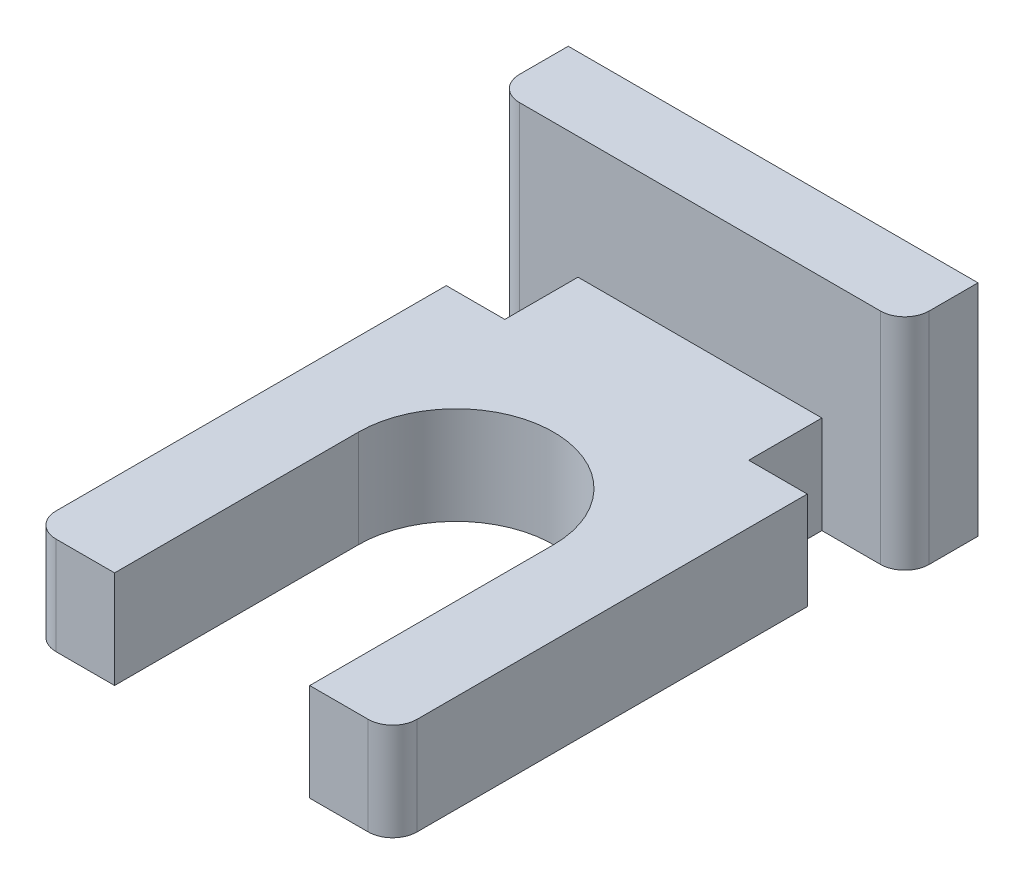
ISO-10303-21;
HEADER;
FILE_DESCRIPTION(('STEP AP214'),'2;1');
FILE_NAME('part.step','',(''),(''),'','','');
FILE_SCHEMA(('AUTOMOTIVE_DESIGN { 1 0 10303 214 1 1 1 1 }'));
ENDSEC;
DATA;
#1=APPLICATION_CONTEXT('core data for automotive mechanical design processes');
#2=APPLICATION_PROTOCOL_DEFINITION('international standard','automotive_design',2000,#1);
#3=PRODUCT_CONTEXT('',#1,'mechanical');
#4=PRODUCT('Part','Part','',(#3));
#5=PRODUCT_RELATED_PRODUCT_CATEGORY('part','',(#4));
#6=PRODUCT_DEFINITION_FORMATION('','',#4);
#7=PRODUCT_DEFINITION_CONTEXT('part definition',#1,'design');
#8=PRODUCT_DEFINITION('design','',#6,#7);
#9=PRODUCT_DEFINITION_SHAPE('','',#8);
#10=(LENGTH_UNIT() NAMED_UNIT(*) SI_UNIT(.MILLI.,.METRE.));
#11=(NAMED_UNIT(*) PLANE_ANGLE_UNIT() SI_UNIT($,.RADIAN.));
#12=(NAMED_UNIT(*) SI_UNIT($,.STERADIAN.) SOLID_ANGLE_UNIT());
#13=UNCERTAINTY_MEASURE_WITH_UNIT(LENGTH_MEASURE(1.E-05),#10,'distance_accuracy_value','');
#14=(GEOMETRIC_REPRESENTATION_CONTEXT(3) GLOBAL_UNCERTAINTY_ASSIGNED_CONTEXT((#13)) GLOBAL_UNIT_ASSIGNED_CONTEXT((#10,
#11,#12)) REPRESENTATION_CONTEXT('',''));
#15=CARTESIAN_POINT('',(0.,0.,0.));
#16=DIRECTION('',(0.,0.,1.));
#17=DIRECTION('',(1.,0.,0.));
#18=AXIS2_PLACEMENT_3D('',#15,#16,#17);
#19=CARTESIAN_POINT('',(0.,0.,15.));
#20=DIRECTION('',(0.,0.,-1.));
#21=DIRECTION('',(-1.,0.,0.));
#22=AXIS2_PLACEMENT_3D('',#19,#20,#21);
#23=PLANE('',#22);
#24=DIRECTION('',(1.,0.,0.));
#25=VECTOR('',#24,1.);
#26=CARTESIAN_POINT('',(-42.,-22.5,15.));
#27=LINE('',#26,#25);
#28=CARTESIAN_POINT('',(25.,-22.5,15.));
#29=VERTEX_POINT('',#28);
#30=CARTESIAN_POINT('',(37.,-22.5,15.));
#31=VERTEX_POINT('',#30);
#32=EDGE_CURVE('E211',#29,#31,#27,.T.);
#33=ORIENTED_EDGE('',*,*,#32,.T.);
#34=DIRECTION('',(0.,1.,0.));
#35=VECTOR('',#34,1.);
#36=CARTESIAN_POINT('',(37.,0.,15.));
#37=LINE('',#36,#35);
#38=CARTESIAN_POINT('',(37.,22.5,15.));
#39=VERTEX_POINT('',#38);
#40=EDGE_CURVE('E232',#31,#39,#37,.T.);
#41=ORIENTED_EDGE('',*,*,#40,.T.);
#42=DIRECTION('',(1.,0.,0.));
#43=VECTOR('',#42,1.);
#44=CARTESIAN_POINT('',(-42.,22.5,15.));
#45=LINE('',#44,#43);
#46=CARTESIAN_POINT('',(-37.,22.5,15.));
#47=VERTEX_POINT('',#46);
#48=EDGE_CURVE('E208',#47,#39,#45,.T.);
#49=ORIENTED_EDGE('',*,*,#48,.F.);
#50=DIRECTION('',(0.,1.,0.));
#51=VECTOR('',#50,1.);
#52=CARTESIAN_POINT('',(-37.,-22.5,15.));
#53=LINE('',#52,#51);
#54=CARTESIAN_POINT('',(-37.,-22.5,15.));
#55=VERTEX_POINT('',#54);
#56=EDGE_CURVE('E225',#47,#55,#53,.F.);
#57=ORIENTED_EDGE('',*,*,#56,.T.);
#58=CARTESIAN_POINT('',(-25.,-22.5,15.));
#59=VERTEX_POINT('',#58);
#60=EDGE_CURVE('E213',#55,#59,#27,.T.);
#61=ORIENTED_EDGE('',*,*,#60,.T.);
#62=DIRECTION('',(0.,-1.,0.));
#63=VECTOR('',#62,1.);
#64=CARTESIAN_POINT('',(-25.,-2.5,15.));
#65=LINE('',#64,#63);
#66=CARTESIAN_POINT('',(-25.,-2.5,15.));
#67=VERTEX_POINT('',#66);
#68=EDGE_CURVE('E301',#67,#59,#65,.T.);
#69=ORIENTED_EDGE('',*,*,#68,.F.);
#70=DIRECTION('',(-1.,0.,0.));
#71=VECTOR('',#70,1.);
#72=CARTESIAN_POINT('',(25.,-2.5,15.));
#73=LINE('',#72,#71);
#74=CARTESIAN_POINT('',(25.,-2.5,15.));
#75=VERTEX_POINT('',#74);
#76=EDGE_CURVE('E328',#75,#67,#73,.T.);
#77=ORIENTED_EDGE('',*,*,#76,.F.);
#78=DIRECTION('',(0.,-1.,0.));
#79=VECTOR('',#78,1.);
#80=CARTESIAN_POINT('',(25.,-2.5,15.));
#81=LINE('',#80,#79);
#82=EDGE_CURVE('E304',#75,#29,#81,.T.);
#83=ORIENTED_EDGE('',*,*,#82,.T.);
#84=EDGE_LOOP('',(#33,#41,#49,#57,#61,#69,#77,#83));
#85=FACE_BOUND('',#84,.T.);
#86=ADVANCED_FACE('F37',(#85),#23,.F.);
#87=CARTESIAN_POINT('',(-42.,-22.5,15.));
#88=DIRECTION('',(-1.,0.,0.));
#89=DIRECTION('',(0.,0.,1.));
#90=AXIS2_PLACEMENT_3D('',#87,#88,#89);
#91=PLANE('',#90);
#92=DIRECTION('',(0.,0.,-1.));
#93=VECTOR('',#92,1.);
#94=CARTESIAN_POINT('',(-42.,-22.5,15.));
#95=LINE('',#94,#93);
#96=CARTESIAN_POINT('',(-42.,-22.5,10.));
#97=VERTEX_POINT('',#96);
#98=CARTESIAN_POINT('',(-42.,-22.5,0.));
#99=VERTEX_POINT('',#98);
#100=EDGE_CURVE('E223',#97,#99,#95,.T.);
#101=ORIENTED_EDGE('',*,*,#100,.F.);
#102=DIRECTION('',(0.,1.,0.));
#103=VECTOR('',#102,1.);
#104=CARTESIAN_POINT('',(-42.,22.5,10.));
#105=LINE('',#104,#103);
#106=CARTESIAN_POINT('',(-42.,22.5,10.));
#107=VERTEX_POINT('',#106);
#108=EDGE_CURVE('E249',#97,#107,#105,.T.);
#109=ORIENTED_EDGE('',*,*,#108,.T.);
#110=DIRECTION('',(0.,0.,-1.));
#111=VECTOR('',#110,1.);
#112=CARTESIAN_POINT('',(-42.,22.5,15.));
#113=LINE('',#112,#111);
#114=CARTESIAN_POINT('',(-42.,22.5,0.));
#115=VERTEX_POINT('',#114);
#116=EDGE_CURVE('E214',#107,#115,#113,.T.);
#117=ORIENTED_EDGE('',*,*,#116,.T.);
#118=DIRECTION('',(0.,1.,0.));
#119=VECTOR('',#118,1.);
#120=CARTESIAN_POINT('',(-42.,-22.5,0.));
#121=LINE('',#120,#119);
#122=EDGE_CURVE('E199',#99,#115,#121,.T.);
#123=ORIENTED_EDGE('',*,*,#122,.F.);
#124=EDGE_LOOP('',(#101,#109,#117,#123));
#125=FACE_BOUND('',#124,.T.);
#126=ADVANCED_FACE('F346',(#125),#91,.T.);
#127=CARTESIAN_POINT('',(-42.,-22.5,15.));
#128=DIRECTION('',(0.,1.,0.));
#129=DIRECTION('',(0.,0.,1.));
#130=AXIS2_PLACEMENT_3D('',#127,#128,#129);
#131=PLANE('',#130);
#132=DIRECTION('',(0.,0.,-1.));
#133=VECTOR('',#132,1.);
#134=CARTESIAN_POINT('',(42.,-22.5,15.));
#135=LINE('',#134,#133);
#136=CARTESIAN_POINT('',(42.,-22.5,10.));
#137=VERTEX_POINT('',#136);
#138=CARTESIAN_POINT('',(42.,-22.5,0.));
#139=VERTEX_POINT('',#138);
#140=EDGE_CURVE('E226',#137,#139,#135,.T.);
#141=ORIENTED_EDGE('',*,*,#140,.F.);
#142=CARTESIAN_POINT('',(37.,-22.5,10.));
#143=DIRECTION('',(0.,1.,0.));
#144=DIRECTION('',(0.,0.,1.));
#145=AXIS2_PLACEMENT_3D('',#142,#143,#144);
#146=CIRCLE('',#145,5.);
#147=EDGE_CURVE('E247',#137,#31,#146,.F.);
#148=ORIENTED_EDGE('',*,*,#147,.T.);
#149=ORIENTED_EDGE('',*,*,#32,.F.);
#150=DIRECTION('',(0.,0.,-1.));
#151=VECTOR('',#150,1.);
#152=CARTESIAN_POINT('',(25.,-22.5,30.));
#153=LINE('',#152,#151);
#154=CARTESIAN_POINT('',(25.,-22.5,30.));
#155=VERTEX_POINT('',#154);
#156=EDGE_CURVE('E278',#155,#29,#153,.T.);
#157=ORIENTED_EDGE('',*,*,#156,.F.);
#158=DIRECTION('',(-1.,0.,0.));
#159=VECTOR('',#158,1.);
#160=CARTESIAN_POINT('',(37.,-22.5,30.));
#161=LINE('',#160,#159);
#162=CARTESIAN_POINT('',(37.,-22.5,30.));
#163=VERTEX_POINT('',#162);
#164=EDGE_CURVE('E275',#163,#155,#161,.T.);
#165=ORIENTED_EDGE('',*,*,#164,.F.);
#166=DIRECTION('',(0.,0.,-1.));
#167=VECTOR('',#166,1.);
#168=CARTESIAN_POINT('',(37.,-22.5,115.));
#169=LINE('',#168,#167);
#170=CARTESIAN_POINT('',(37.,-22.5,110.));
#171=VERTEX_POINT('',#170);
#172=EDGE_CURVE('E265',#171,#163,#169,.T.);
#173=ORIENTED_EDGE('',*,*,#172,.F.);
#174=CARTESIAN_POINT('',(32.,-22.5,110.));
#175=DIRECTION('',(0.,1.,0.));
#176=DIRECTION('',(0.,0.,1.));
#177=AXIS2_PLACEMENT_3D('',#174,#175,#176);
#178=CIRCLE('',#177,5.);
#179=CARTESIAN_POINT('',(32.,-22.5,115.));
#180=VERTEX_POINT('',#179);
#181=EDGE_CURVE('E241',#171,#180,#178,.F.);
#182=ORIENTED_EDGE('',*,*,#181,.T.);
#183=DIRECTION('',(1.,0.,0.));
#184=VECTOR('',#183,1.);
#185=CARTESIAN_POINT('',(20.,-22.5,115.));
#186=LINE('',#185,#184);
#187=CARTESIAN_POINT('',(20.,-22.5,115.));
#188=VERTEX_POINT('',#187);
#189=EDGE_CURVE('E276',#188,#180,#186,.T.);
#190=ORIENTED_EDGE('',*,*,#189,.F.);
#191=DIRECTION('',(0.,0.,1.));
#192=VECTOR('',#191,1.);
#193=CARTESIAN_POINT('',(20.,-22.5,65.));
#194=LINE('',#193,#192);
#195=CARTESIAN_POINT('',(20.,-22.5,65.));
#196=VERTEX_POINT('',#195);
#197=EDGE_CURVE('E280',#196,#188,#194,.T.);
#198=ORIENTED_EDGE('',*,*,#197,.F.);
#199=CARTESIAN_POINT('',(0.,-22.5,65.));
#200=DIRECTION('',(0.,-1.,0.));
#201=DIRECTION('',(0.,0.,-1.));
#202=AXIS2_PLACEMENT_3D('',#199,#200,#201);
#203=CIRCLE('',#202,20.);
#204=CARTESIAN_POINT('',(-20.,-22.5,65.));
#205=VERTEX_POINT('',#204);
#206=EDGE_CURVE('E317',#205,#196,#203,.T.);
#207=ORIENTED_EDGE('',*,*,#206,.F.);
#208=DIRECTION('',(0.,0.,-1.));
#209=VECTOR('',#208,1.);
#210=CARTESIAN_POINT('',(-20.,-22.5,115.));
#211=LINE('',#210,#209);
#212=CARTESIAN_POINT('',(-20.,-22.5,115.));
#213=VERTEX_POINT('',#212);
#214=EDGE_CURVE('E198',#213,#205,#211,.T.);
#215=ORIENTED_EDGE('',*,*,#214,.F.);
#216=DIRECTION('',(1.,0.,0.));
#217=VECTOR('',#216,1.);
#218=CARTESIAN_POINT('',(-37.,-22.5,115.));
#219=LINE('',#218,#217);
#220=CARTESIAN_POINT('',(-32.,-22.5,115.));
#221=VERTEX_POINT('',#220);
#222=EDGE_CURVE('E194',#221,#213,#219,.T.);
#223=ORIENTED_EDGE('',*,*,#222,.F.);
#224=CARTESIAN_POINT('',(-32.,-22.5,110.));
#225=DIRECTION('',(0.,1.,0.));
#226=DIRECTION('',(0.,0.,1.));
#227=AXIS2_PLACEMENT_3D('',#224,#225,#226);
#228=CIRCLE('',#227,5.);
#229=CARTESIAN_POINT('',(-37.,-22.5,110.));
#230=VERTEX_POINT('',#229);
#231=EDGE_CURVE('E243',#221,#230,#228,.F.);
#232=ORIENTED_EDGE('',*,*,#231,.T.);
#233=DIRECTION('',(0.,0.,1.));
#234=VECTOR('',#233,1.);
#235=CARTESIAN_POINT('',(-37.,-22.5,30.));
#236=LINE('',#235,#234);
#237=CARTESIAN_POINT('',(-37.,-22.5,30.));
#238=VERTEX_POINT('',#237);
#239=EDGE_CURVE('E289',#238,#230,#236,.T.);
#240=ORIENTED_EDGE('',*,*,#239,.F.);
#241=DIRECTION('',(-1.,0.,0.));
#242=VECTOR('',#241,1.);
#243=CARTESIAN_POINT('',(-25.,-22.5,30.));
#244=LINE('',#243,#242);
#245=CARTESIAN_POINT('',(-25.,-22.5,30.));
#246=VERTEX_POINT('',#245);
#247=EDGE_CURVE('E287',#246,#238,#244,.T.);
#248=ORIENTED_EDGE('',*,*,#247,.F.);
#249=DIRECTION('',(0.,0.,1.));
#250=VECTOR('',#249,1.);
#251=CARTESIAN_POINT('',(-25.,-22.5,15.));
#252=LINE('',#251,#250);
#253=EDGE_CURVE('E285',#59,#246,#252,.T.);
#254=ORIENTED_EDGE('',*,*,#253,.F.);
#255=ORIENTED_EDGE('',*,*,#60,.F.);
#256=CARTESIAN_POINT('',(-37.,-22.5,10.));
#257=DIRECTION('',(0.,1.,0.));
#258=DIRECTION('',(0.,0.,1.));
#259=AXIS2_PLACEMENT_3D('',#256,#257,#258);
#260=CIRCLE('',#259,5.);
#261=EDGE_CURVE('E245',#55,#97,#260,.F.);
#262=ORIENTED_EDGE('',*,*,#261,.T.);
#263=ORIENTED_EDGE('',*,*,#100,.T.);
#264=DIRECTION('',(1.,0.,0.));
#265=VECTOR('',#264,1.);
#266=CARTESIAN_POINT('',(-42.,-22.5,0.));
#267=LINE('',#266,#265);
#268=EDGE_CURVE('E212',#99,#139,#267,.T.);
#269=ORIENTED_EDGE('',*,*,#268,.T.);
#270=EDGE_LOOP('',(#141,#148,#149,#157,#165,#173,#182,#190,#198,#207,#215,#223,#232,#240,#248,
#254,#255,#262,#263,#269));
#271=FACE_BOUND('',#270,.T.);
#272=ADVANCED_FACE('F272',(#271),#131,.F.);
#273=CARTESIAN_POINT('',(42.,-22.5,15.));
#274=DIRECTION('',(-1.,0.,0.));
#275=DIRECTION('',(0.,0.,1.));
#276=AXIS2_PLACEMENT_3D('',#273,#274,#275);
#277=PLANE('',#276);
#278=DIRECTION('',(0.,0.,-1.));
#279=VECTOR('',#278,1.);
#280=CARTESIAN_POINT('',(42.,22.5,15.));
#281=LINE('',#280,#279);
#282=CARTESIAN_POINT('',(42.,22.5,10.));
#283=VERTEX_POINT('',#282);
#284=CARTESIAN_POINT('',(42.,22.5,0.));
#285=VERTEX_POINT('',#284);
#286=EDGE_CURVE('E228',#283,#285,#281,.T.);
#287=ORIENTED_EDGE('',*,*,#286,.F.);
#288=DIRECTION('',(0.,1.,0.));
#289=VECTOR('',#288,1.);
#290=CARTESIAN_POINT('',(42.,-22.5,10.));
#291=LINE('',#290,#289);
#292=EDGE_CURVE('E239',#283,#137,#291,.F.);
#293=ORIENTED_EDGE('',*,*,#292,.T.);
#294=ORIENTED_EDGE('',*,*,#140,.T.);
#295=DIRECTION('',(0.,1.,0.));
#296=VECTOR('',#295,1.);
#297=CARTESIAN_POINT('',(42.,-22.5,0.));
#298=LINE('',#297,#296);
#299=EDGE_CURVE('E218',#139,#285,#298,.T.);
#300=ORIENTED_EDGE('',*,*,#299,.T.);
#301=EDGE_LOOP('',(#287,#293,#294,#300));
#302=FACE_BOUND('',#301,.T.);
#303=ADVANCED_FACE('F364',(#302),#277,.F.);
#304=CARTESIAN_POINT('',(-42.,22.5,15.));
#305=DIRECTION('',(0.,1.,0.));
#306=DIRECTION('',(0.,0.,1.));
#307=AXIS2_PLACEMENT_3D('',#304,#305,#306);
#308=PLANE('',#307);
#309=ORIENTED_EDGE('',*,*,#48,.T.);
#310=CARTESIAN_POINT('',(37.,22.5,10.));
#311=DIRECTION('',(0.,1.,0.));
#312=DIRECTION('',(0.,0.,1.));
#313=AXIS2_PLACEMENT_3D('',#310,#311,#312);
#314=CIRCLE('',#313,5.);
#315=EDGE_CURVE('E237',#39,#283,#314,.T.);
#316=ORIENTED_EDGE('',*,*,#315,.T.);
#317=ORIENTED_EDGE('',*,*,#286,.T.);
#318=DIRECTION('',(1.,0.,0.));
#319=VECTOR('',#318,1.);
#320=CARTESIAN_POINT('',(-42.,22.5,0.));
#321=LINE('',#320,#319);
#322=EDGE_CURVE('E202',#115,#285,#321,.T.);
#323=ORIENTED_EDGE('',*,*,#322,.F.);
#324=ORIENTED_EDGE('',*,*,#116,.F.);
#325=CARTESIAN_POINT('',(-37.,22.5,10.));
#326=DIRECTION('',(0.,1.,0.));
#327=DIRECTION('',(0.,0.,1.));
#328=AXIS2_PLACEMENT_3D('',#325,#326,#327);
#329=CIRCLE('',#328,5.);
#330=EDGE_CURVE('E235',#107,#47,#329,.T.);
#331=ORIENTED_EDGE('',*,*,#330,.T.);
#332=EDGE_LOOP('',(#309,#316,#317,#323,#324,#331));
#333=FACE_BOUND('',#332,.T.);
#334=ADVANCED_FACE('F360',(#333),#308,.T.);
#335=CARTESIAN_POINT('',(0.,0.,0.));
#336=DIRECTION('',(0.,0.,-1.));
#337=DIRECTION('',(-1.,0.,0.));
#338=AXIS2_PLACEMENT_3D('',#335,#336,#337);
#339=PLANE('',#338);
#340=ORIENTED_EDGE('',*,*,#122,.T.);
#341=ORIENTED_EDGE('',*,*,#322,.T.);
#342=ORIENTED_EDGE('',*,*,#299,.F.);
#343=ORIENTED_EDGE('',*,*,#268,.F.);
#344=EDGE_LOOP('',(#340,#341,#342,#343));
#345=FACE_BOUND('',#344,.T.);
#346=ADVANCED_FACE('F357',(#345),#339,.T.);
#347=CARTESIAN_POINT('',(-20.,-2.5,115.));
#348=DIRECTION('',(-1.,0.,0.));
#349=DIRECTION('',(0.,0.,1.));
#350=AXIS2_PLACEMENT_3D('',#347,#348,#349);
#351=PLANE('',#350);
#352=ORIENTED_EDGE('',*,*,#214,.T.);
#353=DIRECTION('',(0.,-1.,0.));
#354=VECTOR('',#353,1.);
#355=CARTESIAN_POINT('',(-20.,-2.5,65.));
#356=LINE('',#355,#354);
#357=CARTESIAN_POINT('',(-20.,-2.5,65.));
#358=VERTEX_POINT('',#357);
#359=EDGE_CURVE('E178',#358,#205,#356,.T.);
#360=ORIENTED_EDGE('',*,*,#359,.F.);
#361=DIRECTION('',(0.,0.,-1.));
#362=VECTOR('',#361,1.);
#363=CARTESIAN_POINT('',(-20.,-2.5,115.));
#364=LINE('',#363,#362);
#365=CARTESIAN_POINT('',(-20.,-2.5,115.));
#366=VERTEX_POINT('',#365);
#367=EDGE_CURVE('E184',#366,#358,#364,.T.);
#368=ORIENTED_EDGE('',*,*,#367,.F.);
#369=DIRECTION('',(0.,-1.,0.));
#370=VECTOR('',#369,1.);
#371=CARTESIAN_POINT('',(-20.,-2.5,115.));
#372=LINE('',#371,#370);
#373=EDGE_CURVE('E293',#366,#213,#372,.T.);
#374=ORIENTED_EDGE('',*,*,#373,.T.);
#375=EDGE_LOOP('',(#352,#360,#368,#374));
#376=FACE_BOUND('',#375,.T.);
#377=ADVANCED_FACE('F196',(#376),#351,.F.);
#378=CARTESIAN_POINT('',(0.,-2.5,65.));
#379=DIRECTION('',(0.,-1.,0.));
#380=DIRECTION('',(0.,0.,-1.));
#381=AXIS2_PLACEMENT_3D('',#378,#379,#380);
#382=CYLINDRICAL_SURFACE('',#381,20.);
#383=ORIENTED_EDGE('',*,*,#206,.T.);
#384=DIRECTION('',(0.,-1.,0.));
#385=VECTOR('',#384,1.);
#386=CARTESIAN_POINT('',(20.,-2.5,65.));
#387=LINE('',#386,#385);
#388=CARTESIAN_POINT('',(20.,-2.5,65.));
#389=VERTEX_POINT('',#388);
#390=EDGE_CURVE('E181',#389,#196,#387,.T.);
#391=ORIENTED_EDGE('',*,*,#390,.F.);
#392=CARTESIAN_POINT('',(0.,-2.5,65.));
#393=DIRECTION('',(0.,-1.,0.));
#394=DIRECTION('',(0.,0.,-1.));
#395=AXIS2_PLACEMENT_3D('',#392,#393,#394);
#396=CIRCLE('',#395,20.);
#397=EDGE_CURVE('E174',#358,#389,#396,.T.);
#398=ORIENTED_EDGE('',*,*,#397,.F.);
#399=ORIENTED_EDGE('',*,*,#359,.T.);
#400=EDGE_LOOP('',(#383,#391,#398,#399));
#401=FACE_BOUND('',#400,.T.);
#402=ADVANCED_FACE('F176',(#401),#382,.F.);
#403=CARTESIAN_POINT('',(20.,-2.5,65.));
#404=DIRECTION('',(1.,0.,0.));
#405=DIRECTION('',(0.,0.,-1.));
#406=AXIS2_PLACEMENT_3D('',#403,#404,#405);
#407=PLANE('',#406);
#408=ORIENTED_EDGE('',*,*,#197,.T.);
#409=DIRECTION('',(0.,-1.,0.));
#410=VECTOR('',#409,1.);
#411=CARTESIAN_POINT('',(20.,-2.5,115.));
#412=LINE('',#411,#410);
#413=CARTESIAN_POINT('',(20.,-2.5,115.));
#414=VERTEX_POINT('',#413);
#415=EDGE_CURVE('E204',#414,#188,#412,.T.);
#416=ORIENTED_EDGE('',*,*,#415,.F.);
#417=DIRECTION('',(0.,0.,1.));
#418=VECTOR('',#417,1.);
#419=CARTESIAN_POINT('',(20.,-2.5,65.));
#420=LINE('',#419,#418);
#421=EDGE_CURVE('E183',#389,#414,#420,.T.);
#422=ORIENTED_EDGE('',*,*,#421,.F.);
#423=ORIENTED_EDGE('',*,*,#390,.T.);
#424=EDGE_LOOP('',(#408,#416,#422,#423));
#425=FACE_BOUND('',#424,.T.);
#426=ADVANCED_FACE('F336',(#425),#407,.F.);
#427=CARTESIAN_POINT('',(20.,-2.5,115.));
#428=DIRECTION('',(0.,0.,-1.));
#429=DIRECTION('',(-1.,0.,0.));
#430=AXIS2_PLACEMENT_3D('',#427,#428,#429);
#431=PLANE('',#430);
#432=ORIENTED_EDGE('',*,*,#189,.T.);
#433=DIRECTION('',(0.,-1.,0.));
#434=VECTOR('',#433,1.);
#435=CARTESIAN_POINT('',(32.,-2.5,115.));
#436=LINE('',#435,#434);
#437=CARTESIAN_POINT('',(32.,-2.5,115.));
#438=VERTEX_POINT('',#437);
#439=EDGE_CURVE('E11',#180,#438,#436,.F.);
#440=ORIENTED_EDGE('',*,*,#439,.T.);
#441=DIRECTION('',(1.,0.,0.));
#442=VECTOR('',#441,1.);
#443=CARTESIAN_POINT('',(20.,-2.5,115.));
#444=LINE('',#443,#442);
#445=EDGE_CURVE('E314',#414,#438,#444,.T.);
#446=ORIENTED_EDGE('',*,*,#445,.F.);
#447=ORIENTED_EDGE('',*,*,#415,.T.);
#448=EDGE_LOOP('',(#432,#440,#446,#447));
#449=FACE_BOUND('',#448,.T.);
#450=ADVANCED_FACE('F313',(#449),#431,.F.);
#451=CARTESIAN_POINT('',(37.,-2.5,115.));
#452=DIRECTION('',(-1.,0.,0.));
#453=DIRECTION('',(0.,0.,1.));
#454=AXIS2_PLACEMENT_3D('',#451,#452,#453);
#455=PLANE('',#454);
#456=DIRECTION('',(0.,0.,-1.));
#457=VECTOR('',#456,1.);
#458=CARTESIAN_POINT('',(37.,-2.5,115.));
#459=LINE('',#458,#457);
#460=CARTESIAN_POINT('',(37.,-2.5,110.));
#461=VERTEX_POINT('',#460);
#462=CARTESIAN_POINT('',(37.,-2.5,30.));
#463=VERTEX_POINT('',#462);
#464=EDGE_CURVE('E267',#461,#463,#459,.T.);
#465=ORIENTED_EDGE('',*,*,#464,.F.);
#466=DIRECTION('',(0.,-1.,0.));
#467=VECTOR('',#466,1.);
#468=CARTESIAN_POINT('',(37.,-2.5,110.));
#469=LINE('',#468,#467);
#470=EDGE_CURVE('E45',#461,#171,#469,.T.);
#471=ORIENTED_EDGE('',*,*,#470,.T.);
#472=ORIENTED_EDGE('',*,*,#172,.T.);
#473=DIRECTION('',(0.,-1.,0.));
#474=VECTOR('',#473,1.);
#475=CARTESIAN_POINT('',(37.,-2.5,30.));
#476=LINE('',#475,#474);
#477=EDGE_CURVE('E310',#463,#163,#476,.T.);
#478=ORIENTED_EDGE('',*,*,#477,.F.);
#479=EDGE_LOOP('',(#465,#471,#472,#478));
#480=FACE_BOUND('',#479,.T.);
#481=ADVANCED_FACE('F263',(#480),#455,.F.);
#482=CARTESIAN_POINT('',(37.,-2.5,30.));
#483=DIRECTION('',(0.,0.,1.));
#484=DIRECTION('',(1.,0.,0.));
#485=AXIS2_PLACEMENT_3D('',#482,#483,#484);
#486=PLANE('',#485);
#487=ORIENTED_EDGE('',*,*,#164,.T.);
#488=DIRECTION('',(0.,-1.,0.));
#489=VECTOR('',#488,1.);
#490=CARTESIAN_POINT('',(25.,-2.5,30.));
#491=LINE('',#490,#489);
#492=CARTESIAN_POINT('',(25.,-2.5,30.));
#493=VERTEX_POINT('',#492);
#494=EDGE_CURVE('E307',#493,#155,#491,.T.);
#495=ORIENTED_EDGE('',*,*,#494,.F.);
#496=DIRECTION('',(-1.,0.,0.));
#497=VECTOR('',#496,1.);
#498=CARTESIAN_POINT('',(37.,-2.5,30.));
#499=LINE('',#498,#497);
#500=EDGE_CURVE('E332',#463,#493,#499,.T.);
#501=ORIENTED_EDGE('',*,*,#500,.F.);
#502=ORIENTED_EDGE('',*,*,#477,.T.);
#503=EDGE_LOOP('',(#487,#495,#501,#502));
#504=FACE_BOUND('',#503,.T.);
#505=ADVANCED_FACE('F429',(#504),#486,.F.);
#506=CARTESIAN_POINT('',(25.,-2.5,30.));
#507=DIRECTION('',(-1.,0.,0.));
#508=DIRECTION('',(0.,0.,1.));
#509=AXIS2_PLACEMENT_3D('',#506,#507,#508);
#510=PLANE('',#509);
#511=ORIENTED_EDGE('',*,*,#156,.T.);
#512=ORIENTED_EDGE('',*,*,#82,.F.);
#513=DIRECTION('',(0.,0.,-1.));
#514=VECTOR('',#513,1.);
#515=CARTESIAN_POINT('',(25.,-2.5,30.));
#516=LINE('',#515,#514);
#517=EDGE_CURVE('E330',#493,#75,#516,.T.);
#518=ORIENTED_EDGE('',*,*,#517,.F.);
#519=ORIENTED_EDGE('',*,*,#494,.T.);
#520=EDGE_LOOP('',(#511,#512,#518,#519));
#521=FACE_BOUND('',#520,.T.);
#522=ADVANCED_FACE('F424',(#521),#510,.F.);
#523=CARTESIAN_POINT('',(-25.,-2.5,15.));
#524=DIRECTION('',(1.,0.,0.));
#525=DIRECTION('',(0.,0.,-1.));
#526=AXIS2_PLACEMENT_3D('',#523,#524,#525);
#527=PLANE('',#526);
#528=ORIENTED_EDGE('',*,*,#253,.T.);
#529=DIRECTION('',(0.,-1.,0.));
#530=VECTOR('',#529,1.);
#531=CARTESIAN_POINT('',(-25.,-2.5,30.));
#532=LINE('',#531,#530);
#533=CARTESIAN_POINT('',(-25.,-2.5,30.));
#534=VERTEX_POINT('',#533);
#535=EDGE_CURVE('E298',#534,#246,#532,.T.);
#536=ORIENTED_EDGE('',*,*,#535,.F.);
#537=DIRECTION('',(0.,0.,1.));
#538=VECTOR('',#537,1.);
#539=CARTESIAN_POINT('',(-25.,-2.5,15.));
#540=LINE('',#539,#538);
#541=EDGE_CURVE('E326',#67,#534,#540,.T.);
#542=ORIENTED_EDGE('',*,*,#541,.F.);
#543=ORIENTED_EDGE('',*,*,#68,.T.);
#544=EDGE_LOOP('',(#528,#536,#542,#543));
#545=FACE_BOUND('',#544,.T.);
#546=ADVANCED_FACE('F404',(#545),#527,.F.);
#547=CARTESIAN_POINT('',(-25.,-2.5,30.));
#548=DIRECTION('',(0.,0.,1.));
#549=DIRECTION('',(1.,0.,0.));
#550=AXIS2_PLACEMENT_3D('',#547,#548,#549);
#551=PLANE('',#550);
#552=ORIENTED_EDGE('',*,*,#247,.T.);
#553=DIRECTION('',(0.,-1.,0.));
#554=VECTOR('',#553,1.);
#555=CARTESIAN_POINT('',(-37.,-2.5,30.));
#556=LINE('',#555,#554);
#557=CARTESIAN_POINT('',(-37.,-2.5,30.));
#558=VERTEX_POINT('',#557);
#559=EDGE_CURVE('E295',#558,#238,#556,.T.);
#560=ORIENTED_EDGE('',*,*,#559,.F.);
#561=DIRECTION('',(-1.,0.,0.));
#562=VECTOR('',#561,1.);
#563=CARTESIAN_POINT('',(-25.,-2.5,30.));
#564=LINE('',#563,#562);
#565=EDGE_CURVE('E324',#534,#558,#564,.T.);
#566=ORIENTED_EDGE('',*,*,#565,.F.);
#567=ORIENTED_EDGE('',*,*,#535,.T.);
#568=EDGE_LOOP('',(#552,#560,#566,#567));
#569=FACE_BOUND('',#568,.T.);
#570=ADVANCED_FACE('F398',(#569),#551,.F.);
#571=CARTESIAN_POINT('',(-37.,-2.5,30.));
#572=DIRECTION('',(1.,0.,0.));
#573=DIRECTION('',(0.,0.,-1.));
#574=AXIS2_PLACEMENT_3D('',#571,#572,#573);
#575=PLANE('',#574);
#576=ORIENTED_EDGE('',*,*,#239,.T.);
#577=DIRECTION('',(0.,-1.,0.));
#578=VECTOR('',#577,1.);
#579=CARTESIAN_POINT('',(-37.,-2.5,110.));
#580=LINE('',#579,#578);
#581=CARTESIAN_POINT('',(-37.,-2.5,110.));
#582=VERTEX_POINT('',#581);
#583=EDGE_CURVE('E255',#230,#582,#580,.F.);
#584=ORIENTED_EDGE('',*,*,#583,.T.);
#585=DIRECTION('',(0.,0.,1.));
#586=VECTOR('',#585,1.);
#587=CARTESIAN_POINT('',(-37.,-2.5,30.));
#588=LINE('',#587,#586);
#589=EDGE_CURVE('E322',#558,#582,#588,.T.);
#590=ORIENTED_EDGE('',*,*,#589,.F.);
#591=ORIENTED_EDGE('',*,*,#559,.T.);
#592=EDGE_LOOP('',(#576,#584,#590,#591));
#593=FACE_BOUND('',#592,.T.);
#594=ADVANCED_FACE('F394',(#593),#575,.F.);
#595=CARTESIAN_POINT('',(-37.,-2.5,115.));
#596=DIRECTION('',(0.,0.,-1.));
#597=DIRECTION('',(-1.,0.,0.));
#598=AXIS2_PLACEMENT_3D('',#595,#596,#597);
#599=PLANE('',#598);
#600=DIRECTION('',(1.,0.,0.));
#601=VECTOR('',#600,1.);
#602=CARTESIAN_POINT('',(-37.,-2.5,115.));
#603=LINE('',#602,#601);
#604=CARTESIAN_POINT('',(-32.,-2.5,115.));
#605=VERTEX_POINT('',#604);
#606=EDGE_CURVE('E190',#605,#366,#603,.T.);
#607=ORIENTED_EDGE('',*,*,#606,.F.);
#608=DIRECTION('',(0.,-1.,0.));
#609=VECTOR('',#608,1.);
#610=CARTESIAN_POINT('',(-32.,-2.5,115.));
#611=LINE('',#610,#609);
#612=EDGE_CURVE('E252',#605,#221,#611,.T.);
#613=ORIENTED_EDGE('',*,*,#612,.T.);
#614=ORIENTED_EDGE('',*,*,#222,.T.);
#615=ORIENTED_EDGE('',*,*,#373,.F.);
#616=EDGE_LOOP('',(#607,#613,#614,#615));
#617=FACE_BOUND('',#616,.T.);
#618=ADVANCED_FACE('F389',(#617),#599,.F.);
#619=CARTESIAN_POINT('',(0.,-2.5,65.));
#620=DIRECTION('',(0.,-1.,0.));
#621=DIRECTION('',(0.,0.,-1.));
#622=AXIS2_PLACEMENT_3D('',#619,#620,#621);
#623=PLANE('',#622);
#624=ORIENTED_EDGE('',*,*,#589,.T.);
#625=CARTESIAN_POINT('',(-32.,-2.5,110.));
#626=DIRECTION('',(0.,-1.,0.));
#627=DIRECTION('',(0.,0.,-1.));
#628=AXIS2_PLACEMENT_3D('',#625,#626,#627);
#629=CIRCLE('',#628,5.);
#630=EDGE_CURVE('E258',#582,#605,#629,.F.);
#631=ORIENTED_EDGE('',*,*,#630,.T.);
#632=ORIENTED_EDGE('',*,*,#606,.T.);
#633=ORIENTED_EDGE('',*,*,#367,.T.);
#634=ORIENTED_EDGE('',*,*,#397,.T.);
#635=ORIENTED_EDGE('',*,*,#421,.T.);
#636=ORIENTED_EDGE('',*,*,#445,.T.);
#637=CARTESIAN_POINT('',(32.,-2.5,110.));
#638=DIRECTION('',(0.,-1.,0.));
#639=DIRECTION('',(0.,0.,-1.));
#640=AXIS2_PLACEMENT_3D('',#637,#638,#639);
#641=CIRCLE('',#640,5.);
#642=EDGE_CURVE('E52',#438,#461,#641,.F.);
#643=ORIENTED_EDGE('',*,*,#642,.T.);
#644=ORIENTED_EDGE('',*,*,#464,.T.);
#645=ORIENTED_EDGE('',*,*,#500,.T.);
#646=ORIENTED_EDGE('',*,*,#517,.T.);
#647=ORIENTED_EDGE('',*,*,#76,.T.);
#648=ORIENTED_EDGE('',*,*,#541,.T.);
#649=ORIENTED_EDGE('',*,*,#565,.T.);
#650=EDGE_LOOP('',(#624,#631,#632,#633,#634,#635,#636,#643,#644,#645,#646,#647,#648,#649));
#651=FACE_BOUND('',#650,.T.);
#652=ADVANCED_FACE('F188',(#651),#623,.F.);
#653=CARTESIAN_POINT('',(37.,0.,10.));
#654=DIRECTION('',(0.,1.,0.));
#655=DIRECTION('',(0.,0.,1.));
#656=AXIS2_PLACEMENT_3D('',#653,#654,#655);
#657=CYLINDRICAL_SURFACE('',#656,5.);
#658=ORIENTED_EDGE('',*,*,#147,.F.);
#659=ORIENTED_EDGE('',*,*,#292,.F.);
#660=ORIENTED_EDGE('',*,*,#315,.F.);
#661=ORIENTED_EDGE('',*,*,#40,.F.);
#662=EDGE_LOOP('',(#658,#659,#660,#661));
#663=FACE_BOUND('',#662,.T.);
#664=ADVANCED_FACE('F371',(#663),#657,.T.);
#665=CARTESIAN_POINT('',(-37.,-22.5,10.));
#666=DIRECTION('',(0.,-1.,0.));
#667=DIRECTION('',(0.,0.,-1.));
#668=AXIS2_PLACEMENT_3D('',#665,#666,#667);
#669=CYLINDRICAL_SURFACE('',#668,5.);
#670=ORIENTED_EDGE('',*,*,#261,.F.);
#671=ORIENTED_EDGE('',*,*,#56,.F.);
#672=ORIENTED_EDGE('',*,*,#330,.F.);
#673=ORIENTED_EDGE('',*,*,#108,.F.);
#674=EDGE_LOOP('',(#670,#671,#672,#673));
#675=FACE_BOUND('',#674,.T.);
#676=ADVANCED_FACE('F374',(#675),#669,.T.);
#677=CARTESIAN_POINT('',(-32.,-2.5,110.));
#678=DIRECTION('',(0.,-1.,0.));
#679=DIRECTION('',(0.,0.,-1.));
#680=AXIS2_PLACEMENT_3D('',#677,#678,#679);
#681=CYLINDRICAL_SURFACE('',#680,5.);
#682=ORIENTED_EDGE('',*,*,#630,.F.);
#683=ORIENTED_EDGE('',*,*,#583,.F.);
#684=ORIENTED_EDGE('',*,*,#231,.F.);
#685=ORIENTED_EDGE('',*,*,#612,.F.);
#686=EDGE_LOOP('',(#682,#683,#684,#685));
#687=FACE_BOUND('',#686,.T.);
#688=ADVANCED_FACE('F377',(#687),#681,.T.);
#689=CARTESIAN_POINT('',(32.,-2.5,110.));
#690=DIRECTION('',(0.,-1.,0.));
#691=DIRECTION('',(0.,0.,-1.));
#692=AXIS2_PLACEMENT_3D('',#689,#690,#691);
#693=CYLINDRICAL_SURFACE('',#692,5.);
#694=ORIENTED_EDGE('',*,*,#642,.F.);
#695=ORIENTED_EDGE('',*,*,#439,.F.);
#696=ORIENTED_EDGE('',*,*,#181,.F.);
#697=ORIENTED_EDGE('',*,*,#470,.F.);
#698=EDGE_LOOP('',(#694,#695,#696,#697));
#699=FACE_BOUND('',#698,.T.);
#700=ADVANCED_FACE('F39',(#699),#693,.T.);
#701=CLOSED_SHELL('',(#86,#126,#272,#303,#334,#346,#377,#402,#426,#450,#481,#505,#522,#546,#570,
#594,#618,#652,#664,#676,#688,#700));
#702=MANIFOLD_SOLID_BREP('B2',#701);
#703=ADVANCED_BREP_SHAPE_REPRESENTATION('',(#18,#702),#14);
#704=SHAPE_DEFINITION_REPRESENTATION(#9,#703);
ENDSEC;
END-ISO-10303-21;
